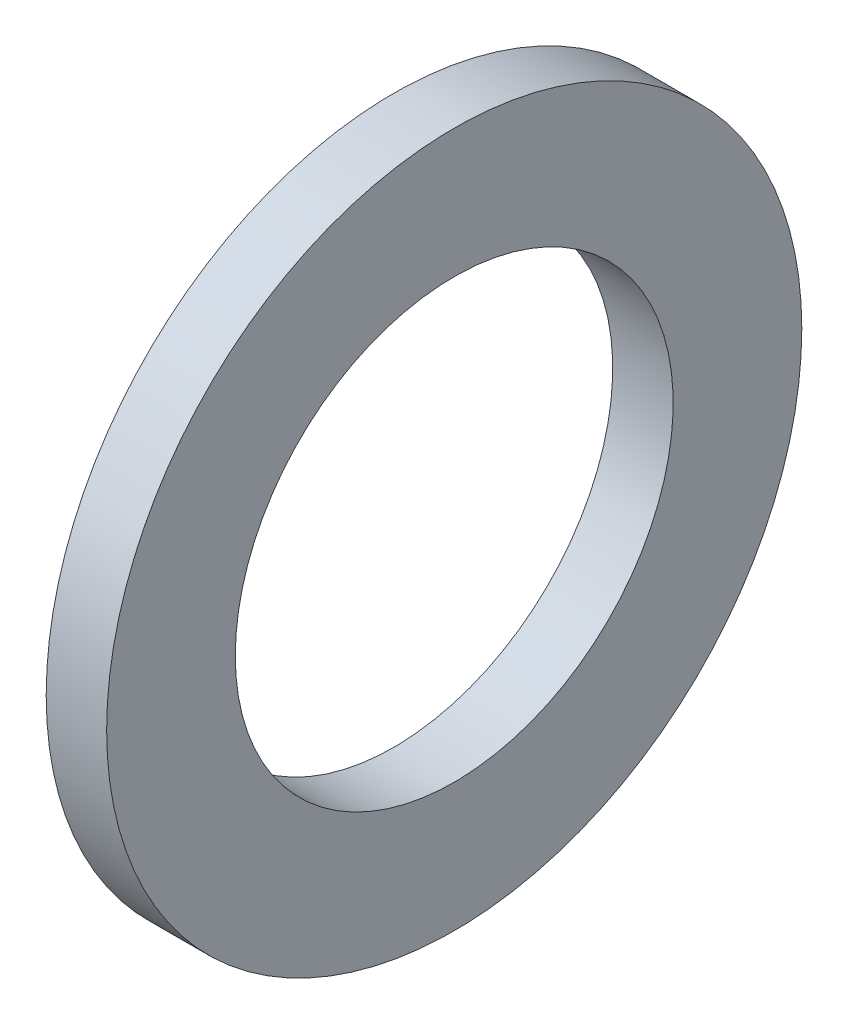
ISO-10303-21;
HEADER;
FILE_DESCRIPTION(('STEP AP214'),'2;1');
FILE_NAME('part.step','',(''),(''),'','','');
FILE_SCHEMA(('AUTOMOTIVE_DESIGN { 1 0 10303 214 1 1 1 1 }'));
ENDSEC;
DATA;
#1=APPLICATION_CONTEXT('core data for automotive mechanical design processes');
#2=APPLICATION_PROTOCOL_DEFINITION('international standard','automotive_design',2000,#1);
#3=PRODUCT_CONTEXT('',#1,'mechanical');
#4=PRODUCT('Part','Part','',(#3));
#5=PRODUCT_RELATED_PRODUCT_CATEGORY('part','',(#4));
#6=PRODUCT_DEFINITION_FORMATION('','',#4);
#7=PRODUCT_DEFINITION_CONTEXT('part definition',#1,'design');
#8=PRODUCT_DEFINITION('design','',#6,#7);
#9=PRODUCT_DEFINITION_SHAPE('','',#8);
#10=(LENGTH_UNIT() NAMED_UNIT(*) SI_UNIT(.MILLI.,.METRE.));
#11=(NAMED_UNIT(*) PLANE_ANGLE_UNIT() SI_UNIT($,.RADIAN.));
#12=(NAMED_UNIT(*) SI_UNIT($,.STERADIAN.) SOLID_ANGLE_UNIT());
#13=UNCERTAINTY_MEASURE_WITH_UNIT(LENGTH_MEASURE(1.E-05),#10,'distance_accuracy_value','');
#14=(GEOMETRIC_REPRESENTATION_CONTEXT(3) GLOBAL_UNCERTAINTY_ASSIGNED_CONTEXT((#13)) GLOBAL_UNIT_ASSIGNED_CONTEXT((#10,
#11,#12)) REPRESENTATION_CONTEXT('',''));
#15=CARTESIAN_POINT('',(0.,0.,0.));
#16=DIRECTION('',(0.,0.,1.));
#17=DIRECTION('',(1.,0.,0.));
#18=AXIS2_PLACEMENT_3D('',#15,#16,#17);
#19=CARTESIAN_POINT('',(-34.9249999999999,0.,0.));
#20=DIRECTION('',(-1.,0.,0.));
#21=DIRECTION('',(0.,0.,1.));
#22=AXIS2_PLACEMENT_3D('',#19,#20,#21);
#23=CYLINDRICAL_SURFACE('',#22,1.84);
#24=CARTESIAN_POINT('',(0.,0.,0.));
#25=DIRECTION('',(-1.,0.,0.));
#26=DIRECTION('',(0.,0.,1.));
#27=AXIS2_PLACEMENT_3D('',#24,#25,#26);
#28=CIRCLE('',#27,1.84);
#29=CARTESIAN_POINT('',(0.,0.,1.84));
#30=VERTEX_POINT('',#29);
#31=EDGE_CURVE('E43',#30,#30,#28,.T.);
#32=ORIENTED_EDGE('',*,*,#31,.F.);
#33=EDGE_LOOP('',(#32));
#34=FACE_BOUND('',#33,.T.);
#35=CARTESIAN_POINT('',(-0.508000000000002,0.,0.));
#36=DIRECTION('',(-1.,0.,0.));
#37=DIRECTION('',(0.,0.,1.));
#38=AXIS2_PLACEMENT_3D('',#35,#36,#37);
#39=CIRCLE('',#38,1.84);
#40=CARTESIAN_POINT('',(-0.508000000000002,0.,1.84));
#41=VERTEX_POINT('',#40);
#42=EDGE_CURVE('E10',#41,#41,#39,.T.);
#43=ORIENTED_EDGE('',*,*,#42,.T.);
#44=EDGE_LOOP('',(#43));
#45=FACE_BOUND('',#44,.T.);
#46=ADVANCED_FACE('F29',(#34,#45),#23,.F.);
#47=CARTESIAN_POINT('',(-0.508000000000001,2.921,0.));
#48=DIRECTION('',(1.,0.,0.));
#49=DIRECTION('',(0.,0.,-1.));
#50=AXIS2_PLACEMENT_3D('',#47,#48,#49);
#51=PLANE('',#50);
#52=ORIENTED_EDGE('',*,*,#42,.F.);
#53=EDGE_LOOP('',(#52));
#54=FACE_BOUND('',#53,.T.);
#55=CARTESIAN_POINT('',(-0.508000000000002,0.,0.));
#56=DIRECTION('',(-1.,0.,0.));
#57=DIRECTION('',(0.,0.,1.));
#58=AXIS2_PLACEMENT_3D('',#55,#56,#57);
#59=CIRCLE('',#58,2.921);
#60=CARTESIAN_POINT('',(-0.508000000000002,0.,2.921));
#61=VERTEX_POINT('',#60);
#62=EDGE_CURVE('E35',#61,#61,#59,.T.);
#63=ORIENTED_EDGE('',*,*,#62,.T.);
#64=EDGE_LOOP('',(#63));
#65=FACE_BOUND('',#64,.T.);
#66=ADVANCED_FACE('F52',(#54,#65),#51,.F.);
#67=CARTESIAN_POINT('',(-34.9249999999999,0.,0.));
#68=DIRECTION('',(-1.,0.,0.));
#69=DIRECTION('',(0.,0.,1.));
#70=AXIS2_PLACEMENT_3D('',#67,#68,#69);
#71=CYLINDRICAL_SURFACE('',#70,2.921);
#72=ORIENTED_EDGE('',*,*,#62,.F.);
#73=EDGE_LOOP('',(#72));
#74=FACE_BOUND('',#73,.T.);
#75=CARTESIAN_POINT('',(0.,0.,0.));
#76=DIRECTION('',(-1.,0.,0.));
#77=DIRECTION('',(0.,0.,1.));
#78=AXIS2_PLACEMENT_3D('',#75,#76,#77);
#79=CIRCLE('',#78,2.921);
#80=CARTESIAN_POINT('',(0.,0.,2.921));
#81=VERTEX_POINT('',#80);
#82=EDGE_CURVE('E39',#81,#81,#79,.T.);
#83=ORIENTED_EDGE('',*,*,#82,.T.);
#84=EDGE_LOOP('',(#83));
#85=FACE_BOUND('',#84,.T.);
#86=ADVANCED_FACE('F56',(#74,#85),#71,.T.);
#87=CARTESIAN_POINT('',(0.,1.84,0.));
#88=DIRECTION('',(-1.,0.,0.));
#89=DIRECTION('',(0.,0.,1.));
#90=AXIS2_PLACEMENT_3D('',#87,#88,#89);
#91=PLANE('',#90);
#92=ORIENTED_EDGE('',*,*,#82,.F.);
#93=EDGE_LOOP('',(#92));
#94=FACE_BOUND('',#93,.T.);
#95=ORIENTED_EDGE('',*,*,#31,.T.);
#96=EDGE_LOOP('',(#95));
#97=FACE_BOUND('',#96,.T.);
#98=ADVANCED_FACE('F49',(#94,#97),#91,.F.);
#99=CLOSED_SHELL('',(#46,#66,#86,#98));
#100=MANIFOLD_SOLID_BREP('B2',#99);
#101=ADVANCED_BREP_SHAPE_REPRESENTATION('',(#18,#100),#14);
#102=SHAPE_DEFINITION_REPRESENTATION(#9,#101);
ENDSEC;
END-ISO-10303-21;
